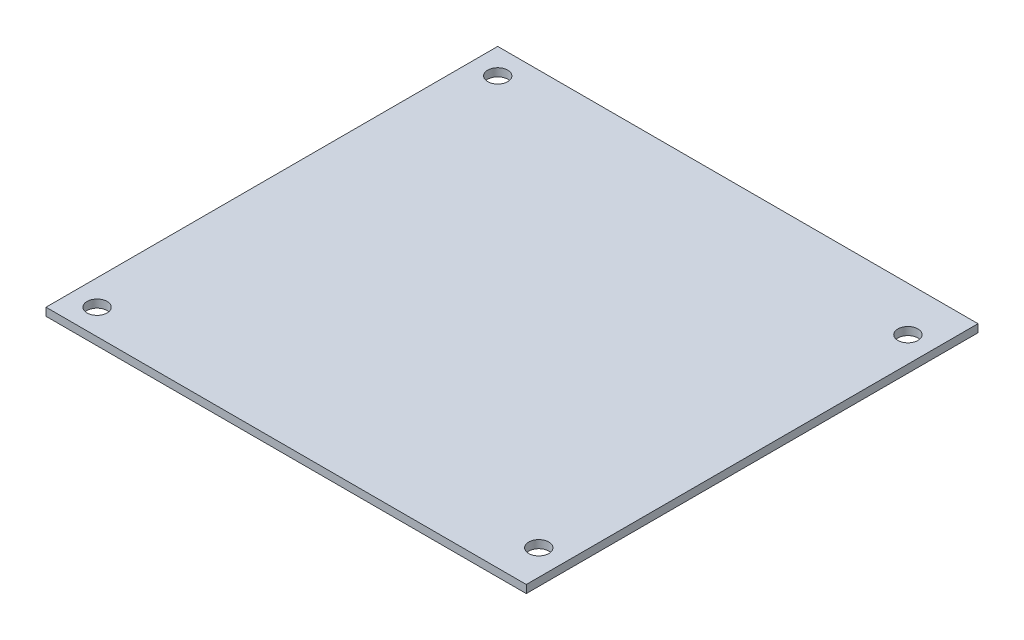
ISO-10303-21;
HEADER;
FILE_DESCRIPTION(('STEP AP214'),'2;1');
FILE_NAME('part.step','',(''),(''),'','','');
FILE_SCHEMA(('AUTOMOTIVE_DESIGN { 1 0 10303 214 1 1 1 1 }'));
ENDSEC;
DATA;
#1=APPLICATION_CONTEXT('core data for automotive mechanical design processes');
#2=APPLICATION_PROTOCOL_DEFINITION('international standard','automotive_design',2000,#1);
#3=PRODUCT_CONTEXT('',#1,'mechanical');
#4=PRODUCT('Part','Part','',(#3));
#5=PRODUCT_RELATED_PRODUCT_CATEGORY('part','',(#4));
#6=PRODUCT_DEFINITION_FORMATION('','',#4);
#7=PRODUCT_DEFINITION_CONTEXT('part definition',#1,'design');
#8=PRODUCT_DEFINITION('design','',#6,#7);
#9=PRODUCT_DEFINITION_SHAPE('','',#8);
#10=(LENGTH_UNIT() NAMED_UNIT(*) SI_UNIT(.MILLI.,.METRE.));
#11=(NAMED_UNIT(*) PLANE_ANGLE_UNIT() SI_UNIT($,.RADIAN.));
#12=(NAMED_UNIT(*) SI_UNIT($,.STERADIAN.) SOLID_ANGLE_UNIT());
#13=UNCERTAINTY_MEASURE_WITH_UNIT(LENGTH_MEASURE(1.E-05),#10,'distance_accuracy_value','');
#14=(GEOMETRIC_REPRESENTATION_CONTEXT(3) GLOBAL_UNCERTAINTY_ASSIGNED_CONTEXT((#13)) GLOBAL_UNIT_ASSIGNED_CONTEXT((#10,
#11,#12)) REPRESENTATION_CONTEXT('',''));
#15=CARTESIAN_POINT('',(0.,0.,0.));
#16=DIRECTION('',(0.,0.,1.));
#17=DIRECTION('',(1.,0.,0.));
#18=AXIS2_PLACEMENT_3D('',#15,#16,#17);
#19=CARTESIAN_POINT('',(0.,1.58,0.));
#20=DIRECTION('',(0.,-1.,0.));
#21=DIRECTION('',(0.,0.,-1.));
#22=AXIS2_PLACEMENT_3D('',#19,#20,#21);
#23=PLANE('',#22);
#24=DIRECTION('',(0.,0.,-1.));
#25=VECTOR('',#24,1.);
#26=CARTESIAN_POINT('',(47.95,1.58,45.1));
#27=LINE('',#26,#25);
#28=CARTESIAN_POINT('',(47.95,1.58,45.1));
#29=VERTEX_POINT('',#28);
#30=CARTESIAN_POINT('',(47.95,1.58,-45.1));
#31=VERTEX_POINT('',#30);
#32=EDGE_CURVE('E85',#29,#31,#27,.T.);
#33=ORIENTED_EDGE('',*,*,#32,.T.);
#34=DIRECTION('',(-1.,0.,0.));
#35=VECTOR('',#34,1.);
#36=CARTESIAN_POINT('',(-47.95,1.58,-45.1));
#37=LINE('',#36,#35);
#38=CARTESIAN_POINT('',(-47.95,1.58,-45.1));
#39=VERTEX_POINT('',#38);
#40=EDGE_CURVE('E80',#31,#39,#37,.T.);
#41=ORIENTED_EDGE('',*,*,#40,.T.);
#42=DIRECTION('',(0.,0.,1.));
#43=VECTOR('',#42,1.);
#44=CARTESIAN_POINT('',(-47.95,1.58,45.1));
#45=LINE('',#44,#43);
#46=CARTESIAN_POINT('',(-47.95,1.58,45.1));
#47=VERTEX_POINT('',#46);
#48=EDGE_CURVE('E83',#39,#47,#45,.T.);
#49=ORIENTED_EDGE('',*,*,#48,.T.);
#50=DIRECTION('',(1.,0.,0.));
#51=VECTOR('',#50,1.);
#52=CARTESIAN_POINT('',(-47.95,1.58,45.1));
#53=LINE('',#52,#51);
#54=EDGE_CURVE('E50',#47,#29,#53,.T.);
#55=ORIENTED_EDGE('',*,*,#54,.T.);
#56=EDGE_LOOP('',(#33,#41,#49,#55));
#57=FACE_BOUND('',#56,.T.);
#58=CARTESIAN_POINT('',(-42.85,1.58,-40.));
#59=DIRECTION('',(0.,1.,0.));
#60=DIRECTION('',(0.,0.,1.));
#61=AXIS2_PLACEMENT_3D('',#58,#59,#60);
#62=CIRCLE('',#61,2.);
#63=CARTESIAN_POINT('',(-42.85,1.58,-42.));
#64=VERTEX_POINT('',#63);
#65=EDGE_CURVE('E100',#64,#64,#62,.T.);
#66=ORIENTED_EDGE('',*,*,#65,.F.);
#67=EDGE_LOOP('',(#66));
#68=FACE_BOUND('',#67,.T.);
#69=CARTESIAN_POINT('',(42.85,1.58,-36.2));
#70=DIRECTION('',(0.,1.,0.));
#71=DIRECTION('',(0.,0.,1.));
#72=AXIS2_PLACEMENT_3D('',#69,#70,#71);
#73=CIRCLE('',#72,2.);
#74=CARTESIAN_POINT('',(42.85,1.58,-38.2));
#75=VERTEX_POINT('',#74);
#76=EDGE_CURVE('E115',#75,#75,#73,.T.);
#77=ORIENTED_EDGE('',*,*,#76,.F.);
#78=EDGE_LOOP('',(#77));
#79=FACE_BOUND('',#78,.T.);
#80=CARTESIAN_POINT('',(-42.85,1.58,40.));
#81=DIRECTION('',(0.,1.,0.));
#82=DIRECTION('',(0.,0.,1.));
#83=AXIS2_PLACEMENT_3D('',#80,#81,#82);
#84=CIRCLE('',#83,2.);
#85=CARTESIAN_POINT('',(-42.85,1.58,38.));
#86=VERTEX_POINT('',#85);
#87=EDGE_CURVE('E121',#86,#86,#84,.T.);
#88=ORIENTED_EDGE('',*,*,#87,.F.);
#89=EDGE_LOOP('',(#88));
#90=FACE_BOUND('',#89,.T.);
#91=CARTESIAN_POINT('',(42.85,1.58,37.5));
#92=DIRECTION('',(0.,1.,0.));
#93=DIRECTION('',(0.,0.,1.));
#94=AXIS2_PLACEMENT_3D('',#91,#92,#93);
#95=CIRCLE('',#94,2.);
#96=CARTESIAN_POINT('',(42.85,1.58,35.5));
#97=VERTEX_POINT('',#96);
#98=EDGE_CURVE('E127',#97,#97,#95,.T.);
#99=ORIENTED_EDGE('',*,*,#98,.F.);
#100=EDGE_LOOP('',(#99));
#101=FACE_BOUND('',#100,.T.);
#102=ADVANCED_FACE('F33',(#57,#68,#79,#90,#101),#23,.F.);
#103=CARTESIAN_POINT('',(0.,0.,0.));
#104=DIRECTION('',(0.,-1.,0.));
#105=DIRECTION('',(0.,0.,-1.));
#106=AXIS2_PLACEMENT_3D('',#103,#104,#105);
#107=PLANE('',#106);
#108=CARTESIAN_POINT('',(-42.85,0.,40.));
#109=DIRECTION('',(0.,1.,0.));
#110=DIRECTION('',(0.,0.,1.));
#111=AXIS2_PLACEMENT_3D('',#108,#109,#110);
#112=CIRCLE('',#111,2.);
#113=CARTESIAN_POINT('',(-42.85,0.,38.));
#114=VERTEX_POINT('',#113);
#115=EDGE_CURVE('E124',#114,#114,#112,.T.);
#116=ORIENTED_EDGE('',*,*,#115,.T.);
#117=EDGE_LOOP('',(#116));
#118=FACE_BOUND('',#117,.T.);
#119=CARTESIAN_POINT('',(-42.85,0.,-40.));
#120=DIRECTION('',(0.,1.,0.));
#121=DIRECTION('',(0.,0.,1.));
#122=AXIS2_PLACEMENT_3D('',#119,#120,#121);
#123=CIRCLE('',#122,2.);
#124=CARTESIAN_POINT('',(-42.85,0.,-42.));
#125=VERTEX_POINT('',#124);
#126=EDGE_CURVE('E112',#125,#125,#123,.T.);
#127=ORIENTED_EDGE('',*,*,#126,.T.);
#128=EDGE_LOOP('',(#127));
#129=FACE_BOUND('',#128,.T.);
#130=DIRECTION('',(0.,0.,-1.));
#131=VECTOR('',#130,1.);
#132=CARTESIAN_POINT('',(47.95,0.,45.1));
#133=LINE('',#132,#131);
#134=CARTESIAN_POINT('',(47.95,0.,45.1));
#135=VERTEX_POINT('',#134);
#136=CARTESIAN_POINT('',(47.95,0.,-45.1));
#137=VERTEX_POINT('',#136);
#138=EDGE_CURVE('E97',#135,#137,#133,.T.);
#139=ORIENTED_EDGE('',*,*,#138,.F.);
#140=DIRECTION('',(1.,0.,0.));
#141=VECTOR('',#140,1.);
#142=CARTESIAN_POINT('',(-47.95,0.,45.1));
#143=LINE('',#142,#141);
#144=CARTESIAN_POINT('',(-47.95,0.,45.1));
#145=VERTEX_POINT('',#144);
#146=EDGE_CURVE('E73',#145,#135,#143,.T.);
#147=ORIENTED_EDGE('',*,*,#146,.F.);
#148=DIRECTION('',(0.,0.,1.));
#149=VECTOR('',#148,1.);
#150=CARTESIAN_POINT('',(-47.95,0.,45.1));
#151=LINE('',#150,#149);
#152=CARTESIAN_POINT('',(-47.95,0.,-45.1));
#153=VERTEX_POINT('',#152);
#154=EDGE_CURVE('E67',#153,#145,#151,.T.);
#155=ORIENTED_EDGE('',*,*,#154,.F.);
#156=DIRECTION('',(-1.,0.,0.));
#157=VECTOR('',#156,1.);
#158=CARTESIAN_POINT('',(-47.95,0.,-45.1));
#159=LINE('',#158,#157);
#160=EDGE_CURVE('E89',#137,#153,#159,.T.);
#161=ORIENTED_EDGE('',*,*,#160,.F.);
#162=EDGE_LOOP('',(#139,#147,#155,#161));
#163=FACE_BOUND('',#162,.T.);
#164=CARTESIAN_POINT('',(42.85,0.,-36.2));
#165=DIRECTION('',(0.,1.,0.));
#166=DIRECTION('',(0.,0.,1.));
#167=AXIS2_PLACEMENT_3D('',#164,#165,#166);
#168=CIRCLE('',#167,2.);
#169=CARTESIAN_POINT('',(42.85,0.,-38.2));
#170=VERTEX_POINT('',#169);
#171=EDGE_CURVE('E118',#170,#170,#168,.T.);
#172=ORIENTED_EDGE('',*,*,#171,.T.);
#173=EDGE_LOOP('',(#172));
#174=FACE_BOUND('',#173,.T.);
#175=CARTESIAN_POINT('',(42.85,0.,37.5));
#176=DIRECTION('',(0.,1.,0.));
#177=DIRECTION('',(0.,0.,1.));
#178=AXIS2_PLACEMENT_3D('',#175,#176,#177);
#179=CIRCLE('',#178,2.);
#180=CARTESIAN_POINT('',(42.85,0.,35.5));
#181=VERTEX_POINT('',#180);
#182=EDGE_CURVE('E130',#181,#181,#179,.T.);
#183=ORIENTED_EDGE('',*,*,#182,.T.);
#184=EDGE_LOOP('',(#183));
#185=FACE_BOUND('',#184,.T.);
#186=ADVANCED_FACE('F108',(#118,#129,#163,#174,#185),#107,.T.);
#187=CARTESIAN_POINT('',(47.95,1.58,45.1));
#188=DIRECTION('',(-1.,0.,0.));
#189=DIRECTION('',(0.,0.,1.));
#190=AXIS2_PLACEMENT_3D('',#187,#188,#189);
#191=PLANE('',#190);
#192=ORIENTED_EDGE('',*,*,#138,.T.);
#193=DIRECTION('',(0.,-1.,0.));
#194=VECTOR('',#193,1.);
#195=CARTESIAN_POINT('',(47.95,1.58,-45.1));
#196=LINE('',#195,#194);
#197=EDGE_CURVE('E11',#31,#137,#196,.T.);
#198=ORIENTED_EDGE('',*,*,#197,.F.);
#199=ORIENTED_EDGE('',*,*,#32,.F.);
#200=DIRECTION('',(0.,-1.,0.));
#201=VECTOR('',#200,1.);
#202=CARTESIAN_POINT('',(47.95,1.58,45.1));
#203=LINE('',#202,#201);
#204=EDGE_CURVE('E93',#29,#135,#203,.T.);
#205=ORIENTED_EDGE('',*,*,#204,.T.);
#206=EDGE_LOOP('',(#192,#198,#199,#205));
#207=FACE_BOUND('',#206,.T.);
#208=ADVANCED_FACE('F35',(#207),#191,.F.);
#209=CARTESIAN_POINT('',(-47.95,1.58,-45.1));
#210=DIRECTION('',(0.,0.,1.));
#211=DIRECTION('',(1.,0.,0.));
#212=AXIS2_PLACEMENT_3D('',#209,#210,#211);
#213=PLANE('',#212);
#214=ORIENTED_EDGE('',*,*,#160,.T.);
#215=DIRECTION('',(0.,-1.,0.));
#216=VECTOR('',#215,1.);
#217=CARTESIAN_POINT('',(-47.95,1.58,-45.1));
#218=LINE('',#217,#216);
#219=EDGE_CURVE('E42',#39,#153,#218,.T.);
#220=ORIENTED_EDGE('',*,*,#219,.F.);
#221=ORIENTED_EDGE('',*,*,#40,.F.);
#222=ORIENTED_EDGE('',*,*,#197,.T.);
#223=EDGE_LOOP('',(#214,#220,#221,#222));
#224=FACE_BOUND('',#223,.T.);
#225=ADVANCED_FACE('F88',(#224),#213,.F.);
#226=CARTESIAN_POINT('',(-47.95,1.58,45.1));
#227=DIRECTION('',(1.,0.,0.));
#228=DIRECTION('',(0.,0.,-1.));
#229=AXIS2_PLACEMENT_3D('',#226,#227,#228);
#230=PLANE('',#229);
#231=ORIENTED_EDGE('',*,*,#154,.T.);
#232=DIRECTION('',(0.,-1.,0.));
#233=VECTOR('',#232,1.);
#234=CARTESIAN_POINT('',(-47.95,1.58,45.1));
#235=LINE('',#234,#233);
#236=EDGE_CURVE('E90',#47,#145,#235,.T.);
#237=ORIENTED_EDGE('',*,*,#236,.F.);
#238=ORIENTED_EDGE('',*,*,#48,.F.);
#239=ORIENTED_EDGE('',*,*,#219,.T.);
#240=EDGE_LOOP('',(#231,#237,#238,#239));
#241=FACE_BOUND('',#240,.T.);
#242=ADVANCED_FACE('F91',(#241),#230,.F.);
#243=CARTESIAN_POINT('',(-47.95,1.58,45.1));
#244=DIRECTION('',(0.,0.,-1.));
#245=DIRECTION('',(-1.,0.,0.));
#246=AXIS2_PLACEMENT_3D('',#243,#244,#245);
#247=PLANE('',#246);
#248=ORIENTED_EDGE('',*,*,#146,.T.);
#249=ORIENTED_EDGE('',*,*,#204,.F.);
#250=ORIENTED_EDGE('',*,*,#54,.F.);
#251=ORIENTED_EDGE('',*,*,#236,.T.);
#252=EDGE_LOOP('',(#248,#249,#250,#251));
#253=FACE_BOUND('',#252,.T.);
#254=ADVANCED_FACE('F105',(#253),#247,.F.);
#255=CARTESIAN_POINT('',(-42.85,1.58,-40.));
#256=DIRECTION('',(0.,-1.,0.));
#257=DIRECTION('',(0.,0.,-1.));
#258=AXIS2_PLACEMENT_3D('',#255,#256,#257);
#259=CYLINDRICAL_SURFACE('',#258,2.);
#260=CARTESIAN_POINT('',(-42.85,1.58,-42.));
#261=CARTESIAN_POINT('',(-42.85,1.56354166666667,-42.));
#262=CARTESIAN_POINT('',(-42.85,1.54708333333333,-42.));
#263=CARTESIAN_POINT('',(-42.85,1.51416666666667,-42.));
#264=CARTESIAN_POINT('',(-42.85,1.49770833333333,-42.));
#265=CARTESIAN_POINT('',(-42.85,1.46479166666667,-42.));
#266=CARTESIAN_POINT('',(-42.85,1.44833333333333,-42.));
#267=CARTESIAN_POINT('',(-42.85,1.41541666666667,-42.));
#268=CARTESIAN_POINT('',(-42.85,1.39895833333333,-42.));
#269=CARTESIAN_POINT('',(-42.85,1.36604166666667,-42.));
#270=CARTESIAN_POINT('',(-42.85,1.34958333333333,-42.));
#271=CARTESIAN_POINT('',(-42.85,1.31666666666667,-42.));
#272=CARTESIAN_POINT('',(-42.85,1.30020833333333,-42.));
#273=CARTESIAN_POINT('',(-42.85,1.26729166666667,-42.));
#274=CARTESIAN_POINT('',(-42.85,1.25083333333333,-42.));
#275=CARTESIAN_POINT('',(-42.85,1.21791666666667,-42.));
#276=CARTESIAN_POINT('',(-42.85,1.20145833333333,-42.));
#277=CARTESIAN_POINT('',(-42.85,1.16854166666667,-42.));
#278=CARTESIAN_POINT('',(-42.85,1.15208333333333,-42.));
#279=CARTESIAN_POINT('',(-42.85,1.11916666666667,-42.));
#280=CARTESIAN_POINT('',(-42.85,1.10270833333333,-42.));
#281=CARTESIAN_POINT('',(-42.85,1.06979166666667,-42.));
#282=CARTESIAN_POINT('',(-42.85,1.05333333333333,-42.));
#283=CARTESIAN_POINT('',(-42.85,1.02041666666667,-42.));
#284=CARTESIAN_POINT('',(-42.85,1.00395833333333,-42.));
#285=CARTESIAN_POINT('',(-42.85,0.971041666666667,-42.));
#286=CARTESIAN_POINT('',(-42.85,0.954583333333333,-42.));
#287=CARTESIAN_POINT('',(-42.85,0.921666666666667,-42.));
#288=CARTESIAN_POINT('',(-42.85,0.905208333333333,-42.));
#289=CARTESIAN_POINT('',(-42.85,0.872291666666667,-42.));
#290=CARTESIAN_POINT('',(-42.85,0.855833333333333,-42.));
#291=CARTESIAN_POINT('',(-42.85,0.822916666666667,-42.));
#292=CARTESIAN_POINT('',(-42.85,0.806458333333333,-42.));
#293=CARTESIAN_POINT('',(-42.85,0.773541666666667,-42.));
#294=CARTESIAN_POINT('',(-42.85,0.757083333333333,-42.));
#295=CARTESIAN_POINT('',(-42.85,0.724166666666667,-42.));
#296=CARTESIAN_POINT('',(-42.85,0.707708333333333,-42.));
#297=CARTESIAN_POINT('',(-42.85,0.674791666666667,-42.));
#298=CARTESIAN_POINT('',(-42.85,0.658333333333333,-42.));
#299=CARTESIAN_POINT('',(-42.85,0.625416666666667,-42.));
#300=CARTESIAN_POINT('',(-42.85,0.608958333333333,-42.));
#301=CARTESIAN_POINT('',(-42.85,0.576041666666667,-42.));
#302=CARTESIAN_POINT('',(-42.85,0.559583333333333,-42.));
#303=CARTESIAN_POINT('',(-42.85,0.526666666666667,-42.));
#304=CARTESIAN_POINT('',(-42.85,0.510208333333333,-42.));
#305=CARTESIAN_POINT('',(-42.85,0.477291666666667,-42.));
#306=CARTESIAN_POINT('',(-42.85,0.460833333333333,-42.));
#307=CARTESIAN_POINT('',(-42.85,0.427916666666667,-42.));
#308=CARTESIAN_POINT('',(-42.85,0.411458333333333,-42.));
#309=CARTESIAN_POINT('',(-42.85,0.378541666666667,-42.));
#310=CARTESIAN_POINT('',(-42.85,0.362083333333333,-42.));
#311=CARTESIAN_POINT('',(-42.85,0.329166666666667,-42.));
#312=CARTESIAN_POINT('',(-42.85,0.312708333333333,-42.));
#313=CARTESIAN_POINT('',(-42.85,0.279791666666667,-42.));
#314=CARTESIAN_POINT('',(-42.85,0.263333333333333,-42.));
#315=CARTESIAN_POINT('',(-42.85,0.230416666666667,-42.));
#316=CARTESIAN_POINT('',(-42.85,0.213958333333333,-42.));
#317=CARTESIAN_POINT('',(-42.85,0.181041666666667,-42.));
#318=CARTESIAN_POINT('',(-42.85,0.164583333333333,-42.));
#319=CARTESIAN_POINT('',(-42.85,0.131666666666667,-42.));
#320=CARTESIAN_POINT('',(-42.85,0.115208333333333,-42.));
#321=CARTESIAN_POINT('',(-42.85,0.0822916666666667,-42.));
#322=CARTESIAN_POINT('',(-42.85,0.0658333333333333,-42.));
#323=CARTESIAN_POINT('',(-42.85,0.0329166666666666,-42.));
#324=CARTESIAN_POINT('',(-42.85,0.0164583333333333,-42.));
#325=CARTESIAN_POINT('',(-42.85,0.,-42.));
#326=B_SPLINE_CURVE_WITH_KNOTS('',3,(#260,#261,#262,#263,#264,#265,#266,#267,#268,#269,#270,
#271,#272,#273,#274,#275,#276,#277,#278,#279,#280,#281,#282,#283,#284,#285,#286,#287,#288,#289,
#290,#291,#292,#293,#294,#295,#296,#297,#298,#299,#300,#301,#302,#303,#304,#305,#306,#307,#308,
#309,#310,#311,#312,#313,#314,#315,#316,#317,#318,#319,#320,#321,#322,#323,#324,#325),
.UNSPECIFIED.,.F.,.F.,(4,2,2,2,2,2,2,2,2,2,2,2,2,2,2,2,2,2,2,2,2,2,2,2,2,2,2,2,2,2,2,2,4),(0.,
0.0493749999999999,0.0987499999999999,0.148125,0.1975,0.246875,0.29625,0.345625,0.395,0.444375,
0.49375,0.543125,0.5925,0.641875,0.69125,0.740625,0.79,0.839375,0.88875,0.938125,0.9875,
1.036875,1.08625,1.135625,1.185,1.234375,1.28375,1.333125,1.3825,1.431875,1.48125,1.530625,
1.58),.UNSPECIFIED.);
#327=EDGE_CURVE('BSEAM147',#64,#125,#326,.T.);
#328=ORIENTED_EDGE('',*,*,#65,.T.);
#329=ORIENTED_EDGE('',*,*,#126,.F.);
#330=ORIENTED_EDGE('',*,*,#327,.T.);
#331=ORIENTED_EDGE('',*,*,#327,.F.);
#332=EDGE_LOOP('',(#328,#330,#329,#331));
#333=FACE_BOUND('',#332,.T.);
#334=ADVANCED_FACE('F147',(#333),#259,.F.);
#335=CARTESIAN_POINT('',(42.85,1.58,-36.2));
#336=DIRECTION('',(0.,-1.,0.));
#337=DIRECTION('',(0.,0.,-1.));
#338=AXIS2_PLACEMENT_3D('',#335,#336,#337);
#339=CYLINDRICAL_SURFACE('',#338,2.);
#340=CARTESIAN_POINT('',(42.85,1.58,-38.2));
#341=CARTESIAN_POINT('',(42.85,1.56354166666667,-38.2));
#342=CARTESIAN_POINT('',(42.85,1.54708333333333,-38.2));
#343=CARTESIAN_POINT('',(42.85,1.51416666666667,-38.2));
#344=CARTESIAN_POINT('',(42.85,1.49770833333333,-38.2));
#345=CARTESIAN_POINT('',(42.85,1.46479166666667,-38.2));
#346=CARTESIAN_POINT('',(42.85,1.44833333333333,-38.2));
#347=CARTESIAN_POINT('',(42.85,1.41541666666667,-38.2));
#348=CARTESIAN_POINT('',(42.85,1.39895833333333,-38.2));
#349=CARTESIAN_POINT('',(42.85,1.36604166666667,-38.2));
#350=CARTESIAN_POINT('',(42.85,1.34958333333333,-38.2));
#351=CARTESIAN_POINT('',(42.85,1.31666666666667,-38.2));
#352=CARTESIAN_POINT('',(42.85,1.30020833333333,-38.2));
#353=CARTESIAN_POINT('',(42.85,1.26729166666667,-38.2));
#354=CARTESIAN_POINT('',(42.85,1.25083333333333,-38.2));
#355=CARTESIAN_POINT('',(42.85,1.21791666666667,-38.2));
#356=CARTESIAN_POINT('',(42.85,1.20145833333333,-38.2));
#357=CARTESIAN_POINT('',(42.85,1.16854166666667,-38.2));
#358=CARTESIAN_POINT('',(42.85,1.15208333333333,-38.2));
#359=CARTESIAN_POINT('',(42.85,1.11916666666667,-38.2));
#360=CARTESIAN_POINT('',(42.85,1.10270833333333,-38.2));
#361=CARTESIAN_POINT('',(42.85,1.06979166666667,-38.2));
#362=CARTESIAN_POINT('',(42.85,1.05333333333333,-38.2));
#363=CARTESIAN_POINT('',(42.85,1.02041666666667,-38.2));
#364=CARTESIAN_POINT('',(42.85,1.00395833333333,-38.2));
#365=CARTESIAN_POINT('',(42.85,0.971041666666667,-38.2));
#366=CARTESIAN_POINT('',(42.85,0.954583333333333,-38.2));
#367=CARTESIAN_POINT('',(42.85,0.921666666666667,-38.2));
#368=CARTESIAN_POINT('',(42.85,0.905208333333333,-38.2));
#369=CARTESIAN_POINT('',(42.85,0.872291666666667,-38.2));
#370=CARTESIAN_POINT('',(42.85,0.855833333333333,-38.2));
#371=CARTESIAN_POINT('',(42.85,0.822916666666667,-38.2));
#372=CARTESIAN_POINT('',(42.85,0.806458333333333,-38.2));
#373=CARTESIAN_POINT('',(42.85,0.773541666666667,-38.2));
#374=CARTESIAN_POINT('',(42.85,0.757083333333333,-38.2));
#375=CARTESIAN_POINT('',(42.85,0.724166666666667,-38.2));
#376=CARTESIAN_POINT('',(42.85,0.707708333333333,-38.2));
#377=CARTESIAN_POINT('',(42.85,0.674791666666667,-38.2));
#378=CARTESIAN_POINT('',(42.85,0.658333333333333,-38.2));
#379=CARTESIAN_POINT('',(42.85,0.625416666666667,-38.2));
#380=CARTESIAN_POINT('',(42.85,0.608958333333333,-38.2));
#381=CARTESIAN_POINT('',(42.85,0.576041666666667,-38.2));
#382=CARTESIAN_POINT('',(42.85,0.559583333333333,-38.2));
#383=CARTESIAN_POINT('',(42.85,0.526666666666667,-38.2));
#384=CARTESIAN_POINT('',(42.85,0.510208333333333,-38.2));
#385=CARTESIAN_POINT('',(42.85,0.477291666666667,-38.2));
#386=CARTESIAN_POINT('',(42.85,0.460833333333333,-38.2));
#387=CARTESIAN_POINT('',(42.85,0.427916666666667,-38.2));
#388=CARTESIAN_POINT('',(42.85,0.411458333333333,-38.2));
#389=CARTESIAN_POINT('',(42.85,0.378541666666667,-38.2));
#390=CARTESIAN_POINT('',(42.85,0.362083333333333,-38.2));
#391=CARTESIAN_POINT('',(42.85,0.329166666666667,-38.2));
#392=CARTESIAN_POINT('',(42.85,0.312708333333333,-38.2));
#393=CARTESIAN_POINT('',(42.85,0.279791666666667,-38.2));
#394=CARTESIAN_POINT('',(42.85,0.263333333333333,-38.2));
#395=CARTESIAN_POINT('',(42.85,0.230416666666667,-38.2));
#396=CARTESIAN_POINT('',(42.85,0.213958333333333,-38.2));
#397=CARTESIAN_POINT('',(42.85,0.181041666666667,-38.2));
#398=CARTESIAN_POINT('',(42.85,0.164583333333333,-38.2));
#399=CARTESIAN_POINT('',(42.85,0.131666666666667,-38.2));
#400=CARTESIAN_POINT('',(42.85,0.115208333333333,-38.2));
#401=CARTESIAN_POINT('',(42.85,0.0822916666666667,-38.2));
#402=CARTESIAN_POINT('',(42.85,0.0658333333333333,-38.2));
#403=CARTESIAN_POINT('',(42.85,0.0329166666666666,-38.2));
#404=CARTESIAN_POINT('',(42.85,0.0164583333333333,-38.2));
#405=CARTESIAN_POINT('',(42.85,0.,-38.2));
#406=B_SPLINE_CURVE_WITH_KNOTS('',3,(#340,#341,#342,#343,#344,#345,#346,#347,#348,#349,#350,
#351,#352,#353,#354,#355,#356,#357,#358,#359,#360,#361,#362,#363,#364,#365,#366,#367,#368,#369,
#370,#371,#372,#373,#374,#375,#376,#377,#378,#379,#380,#381,#382,#383,#384,#385,#386,#387,#388,
#389,#390,#391,#392,#393,#394,#395,#396,#397,#398,#399,#400,#401,#402,#403,#404,#405),
.UNSPECIFIED.,.F.,.F.,(4,2,2,2,2,2,2,2,2,2,2,2,2,2,2,2,2,2,2,2,2,2,2,2,2,2,2,2,2,2,2,2,4),(0.,
0.0493749999999999,0.0987499999999999,0.148125,0.1975,0.246875,0.29625,0.345625,0.395,0.444375,
0.49375,0.543125,0.5925,0.641875,0.69125,0.740625,0.79,0.839375,0.88875,0.938125,0.9875,
1.036875,1.08625,1.135625,1.185,1.234375,1.28375,1.333125,1.3825,1.431875,1.48125,1.530625,
1.58),.UNSPECIFIED.);
#407=EDGE_CURVE('BSEAM193',#75,#170,#406,.T.);
#408=ORIENTED_EDGE('',*,*,#76,.T.);
#409=ORIENTED_EDGE('',*,*,#171,.F.);
#410=ORIENTED_EDGE('',*,*,#407,.T.);
#411=ORIENTED_EDGE('',*,*,#407,.F.);
#412=EDGE_LOOP('',(#408,#410,#409,#411));
#413=FACE_BOUND('',#412,.T.);
#414=ADVANCED_FACE('F193',(#413),#339,.F.);
#415=CARTESIAN_POINT('',(-42.85,1.58,40.));
#416=DIRECTION('',(0.,-1.,0.));
#417=DIRECTION('',(0.,0.,-1.));
#418=AXIS2_PLACEMENT_3D('',#415,#416,#417);
#419=CYLINDRICAL_SURFACE('',#418,2.);
#420=CARTESIAN_POINT('',(-42.85,1.58,38.));
#421=CARTESIAN_POINT('',(-42.85,1.56354166666667,38.));
#422=CARTESIAN_POINT('',(-42.85,1.54708333333333,38.));
#423=CARTESIAN_POINT('',(-42.85,1.51416666666667,38.));
#424=CARTESIAN_POINT('',(-42.85,1.49770833333333,38.));
#425=CARTESIAN_POINT('',(-42.85,1.46479166666667,38.));
#426=CARTESIAN_POINT('',(-42.85,1.44833333333333,38.));
#427=CARTESIAN_POINT('',(-42.85,1.41541666666667,38.));
#428=CARTESIAN_POINT('',(-42.85,1.39895833333333,38.));
#429=CARTESIAN_POINT('',(-42.85,1.36604166666667,38.));
#430=CARTESIAN_POINT('',(-42.85,1.34958333333333,38.));
#431=CARTESIAN_POINT('',(-42.85,1.31666666666667,38.));
#432=CARTESIAN_POINT('',(-42.85,1.30020833333333,38.));
#433=CARTESIAN_POINT('',(-42.85,1.26729166666667,38.));
#434=CARTESIAN_POINT('',(-42.85,1.25083333333333,38.));
#435=CARTESIAN_POINT('',(-42.85,1.21791666666667,38.));
#436=CARTESIAN_POINT('',(-42.85,1.20145833333333,38.));
#437=CARTESIAN_POINT('',(-42.85,1.16854166666667,38.));
#438=CARTESIAN_POINT('',(-42.85,1.15208333333333,38.));
#439=CARTESIAN_POINT('',(-42.85,1.11916666666667,38.));
#440=CARTESIAN_POINT('',(-42.85,1.10270833333333,38.));
#441=CARTESIAN_POINT('',(-42.85,1.06979166666667,38.));
#442=CARTESIAN_POINT('',(-42.85,1.05333333333333,38.));
#443=CARTESIAN_POINT('',(-42.85,1.02041666666667,38.));
#444=CARTESIAN_POINT('',(-42.85,1.00395833333333,38.));
#445=CARTESIAN_POINT('',(-42.85,0.971041666666667,38.));
#446=CARTESIAN_POINT('',(-42.85,0.954583333333333,38.));
#447=CARTESIAN_POINT('',(-42.85,0.921666666666667,38.));
#448=CARTESIAN_POINT('',(-42.85,0.905208333333333,38.));
#449=CARTESIAN_POINT('',(-42.85,0.872291666666667,38.));
#450=CARTESIAN_POINT('',(-42.85,0.855833333333333,38.));
#451=CARTESIAN_POINT('',(-42.85,0.822916666666667,38.));
#452=CARTESIAN_POINT('',(-42.85,0.806458333333333,38.));
#453=CARTESIAN_POINT('',(-42.85,0.773541666666667,38.));
#454=CARTESIAN_POINT('',(-42.85,0.757083333333333,38.));
#455=CARTESIAN_POINT('',(-42.85,0.724166666666667,38.));
#456=CARTESIAN_POINT('',(-42.85,0.707708333333333,38.));
#457=CARTESIAN_POINT('',(-42.85,0.674791666666667,38.));
#458=CARTESIAN_POINT('',(-42.85,0.658333333333333,38.));
#459=CARTESIAN_POINT('',(-42.85,0.625416666666667,38.));
#460=CARTESIAN_POINT('',(-42.85,0.608958333333333,38.));
#461=CARTESIAN_POINT('',(-42.85,0.576041666666667,38.));
#462=CARTESIAN_POINT('',(-42.85,0.559583333333333,38.));
#463=CARTESIAN_POINT('',(-42.85,0.526666666666667,38.));
#464=CARTESIAN_POINT('',(-42.85,0.510208333333333,38.));
#465=CARTESIAN_POINT('',(-42.85,0.477291666666667,38.));
#466=CARTESIAN_POINT('',(-42.85,0.460833333333333,38.));
#467=CARTESIAN_POINT('',(-42.85,0.427916666666667,38.));
#468=CARTESIAN_POINT('',(-42.85,0.411458333333333,38.));
#469=CARTESIAN_POINT('',(-42.85,0.378541666666667,38.));
#470=CARTESIAN_POINT('',(-42.85,0.362083333333333,38.));
#471=CARTESIAN_POINT('',(-42.85,0.329166666666667,38.));
#472=CARTESIAN_POINT('',(-42.85,0.312708333333333,38.));
#473=CARTESIAN_POINT('',(-42.85,0.279791666666667,38.));
#474=CARTESIAN_POINT('',(-42.85,0.263333333333333,38.));
#475=CARTESIAN_POINT('',(-42.85,0.230416666666667,38.));
#476=CARTESIAN_POINT('',(-42.85,0.213958333333333,38.));
#477=CARTESIAN_POINT('',(-42.85,0.181041666666667,38.));
#478=CARTESIAN_POINT('',(-42.85,0.164583333333333,38.));
#479=CARTESIAN_POINT('',(-42.85,0.131666666666667,38.));
#480=CARTESIAN_POINT('',(-42.85,0.115208333333333,38.));
#481=CARTESIAN_POINT('',(-42.85,0.0822916666666667,38.));
#482=CARTESIAN_POINT('',(-42.85,0.0658333333333333,38.));
#483=CARTESIAN_POINT('',(-42.85,0.0329166666666666,38.));
#484=CARTESIAN_POINT('',(-42.85,0.0164583333333333,38.));
#485=CARTESIAN_POINT('',(-42.85,0.,38.));
#486=B_SPLINE_CURVE_WITH_KNOTS('',3,(#420,#421,#422,#423,#424,#425,#426,#427,#428,#429,#430,
#431,#432,#433,#434,#435,#436,#437,#438,#439,#440,#441,#442,#443,#444,#445,#446,#447,#448,#449,
#450,#451,#452,#453,#454,#455,#456,#457,#458,#459,#460,#461,#462,#463,#464,#465,#466,#467,#468,
#469,#470,#471,#472,#473,#474,#475,#476,#477,#478,#479,#480,#481,#482,#483,#484,#485),
.UNSPECIFIED.,.F.,.F.,(4,2,2,2,2,2,2,2,2,2,2,2,2,2,2,2,2,2,2,2,2,2,2,2,2,2,2,2,2,2,2,2,4),(0.,
0.0493749999999999,0.0987499999999999,0.148125,0.1975,0.246875,0.29625,0.345625,0.395,0.444375,
0.49375,0.543125,0.5925,0.641875,0.69125,0.740625,0.79,0.839375,0.88875,0.938125,0.9875,
1.036875,1.08625,1.135625,1.185,1.234375,1.28375,1.333125,1.3825,1.431875,1.48125,1.530625,
1.58),.UNSPECIFIED.);
#487=EDGE_CURVE('BSEAM201',#86,#114,#486,.T.);
#488=ORIENTED_EDGE('',*,*,#87,.T.);
#489=ORIENTED_EDGE('',*,*,#115,.F.);
#490=ORIENTED_EDGE('',*,*,#487,.T.);
#491=ORIENTED_EDGE('',*,*,#487,.F.);
#492=EDGE_LOOP('',(#488,#490,#489,#491));
#493=FACE_BOUND('',#492,.T.);
#494=ADVANCED_FACE('F201',(#493),#419,.F.);
#495=CARTESIAN_POINT('',(42.85,1.58,37.5));
#496=DIRECTION('',(0.,-1.,0.));
#497=DIRECTION('',(0.,0.,-1.));
#498=AXIS2_PLACEMENT_3D('',#495,#496,#497);
#499=CYLINDRICAL_SURFACE('',#498,2.);
#500=CARTESIAN_POINT('',(42.85,1.58,35.5));
#501=CARTESIAN_POINT('',(42.85,1.56354166666667,35.5));
#502=CARTESIAN_POINT('',(42.85,1.54708333333333,35.5));
#503=CARTESIAN_POINT('',(42.85,1.51416666666667,35.5));
#504=CARTESIAN_POINT('',(42.85,1.49770833333333,35.5));
#505=CARTESIAN_POINT('',(42.85,1.46479166666667,35.5));
#506=CARTESIAN_POINT('',(42.85,1.44833333333333,35.5));
#507=CARTESIAN_POINT('',(42.85,1.41541666666667,35.5));
#508=CARTESIAN_POINT('',(42.85,1.39895833333333,35.5));
#509=CARTESIAN_POINT('',(42.85,1.36604166666667,35.5));
#510=CARTESIAN_POINT('',(42.85,1.34958333333333,35.5));
#511=CARTESIAN_POINT('',(42.85,1.31666666666667,35.5));
#512=CARTESIAN_POINT('',(42.85,1.30020833333333,35.5));
#513=CARTESIAN_POINT('',(42.85,1.26729166666667,35.5));
#514=CARTESIAN_POINT('',(42.85,1.25083333333333,35.5));
#515=CARTESIAN_POINT('',(42.85,1.21791666666667,35.5));
#516=CARTESIAN_POINT('',(42.85,1.20145833333333,35.5));
#517=CARTESIAN_POINT('',(42.85,1.16854166666667,35.5));
#518=CARTESIAN_POINT('',(42.85,1.15208333333333,35.5));
#519=CARTESIAN_POINT('',(42.85,1.11916666666667,35.5));
#520=CARTESIAN_POINT('',(42.85,1.10270833333333,35.5));
#521=CARTESIAN_POINT('',(42.85,1.06979166666667,35.5));
#522=CARTESIAN_POINT('',(42.85,1.05333333333333,35.5));
#523=CARTESIAN_POINT('',(42.85,1.02041666666667,35.5));
#524=CARTESIAN_POINT('',(42.85,1.00395833333333,35.5));
#525=CARTESIAN_POINT('',(42.85,0.971041666666667,35.5));
#526=CARTESIAN_POINT('',(42.85,0.954583333333333,35.5));
#527=CARTESIAN_POINT('',(42.85,0.921666666666667,35.5));
#528=CARTESIAN_POINT('',(42.85,0.905208333333333,35.5));
#529=CARTESIAN_POINT('',(42.85,0.872291666666667,35.5));
#530=CARTESIAN_POINT('',(42.85,0.855833333333333,35.5));
#531=CARTESIAN_POINT('',(42.85,0.822916666666667,35.5));
#532=CARTESIAN_POINT('',(42.85,0.806458333333333,35.5));
#533=CARTESIAN_POINT('',(42.85,0.773541666666667,35.5));
#534=CARTESIAN_POINT('',(42.85,0.757083333333333,35.5));
#535=CARTESIAN_POINT('',(42.85,0.724166666666667,35.5));
#536=CARTESIAN_POINT('',(42.85,0.707708333333333,35.5));
#537=CARTESIAN_POINT('',(42.85,0.674791666666667,35.5));
#538=CARTESIAN_POINT('',(42.85,0.658333333333333,35.5));
#539=CARTESIAN_POINT('',(42.85,0.625416666666667,35.5));
#540=CARTESIAN_POINT('',(42.85,0.608958333333333,35.5));
#541=CARTESIAN_POINT('',(42.85,0.576041666666667,35.5));
#542=CARTESIAN_POINT('',(42.85,0.559583333333333,35.5));
#543=CARTESIAN_POINT('',(42.85,0.526666666666667,35.5));
#544=CARTESIAN_POINT('',(42.85,0.510208333333333,35.5));
#545=CARTESIAN_POINT('',(42.85,0.477291666666667,35.5));
#546=CARTESIAN_POINT('',(42.85,0.460833333333333,35.5));
#547=CARTESIAN_POINT('',(42.85,0.427916666666667,35.5));
#548=CARTESIAN_POINT('',(42.85,0.411458333333333,35.5));
#549=CARTESIAN_POINT('',(42.85,0.378541666666667,35.5));
#550=CARTESIAN_POINT('',(42.85,0.362083333333333,35.5));
#551=CARTESIAN_POINT('',(42.85,0.329166666666667,35.5));
#552=CARTESIAN_POINT('',(42.85,0.312708333333333,35.5));
#553=CARTESIAN_POINT('',(42.85,0.279791666666667,35.5));
#554=CARTESIAN_POINT('',(42.85,0.263333333333333,35.5));
#555=CARTESIAN_POINT('',(42.85,0.230416666666667,35.5));
#556=CARTESIAN_POINT('',(42.85,0.213958333333333,35.5));
#557=CARTESIAN_POINT('',(42.85,0.181041666666667,35.5));
#558=CARTESIAN_POINT('',(42.85,0.164583333333333,35.5));
#559=CARTESIAN_POINT('',(42.85,0.131666666666667,35.5));
#560=CARTESIAN_POINT('',(42.85,0.115208333333333,35.5));
#561=CARTESIAN_POINT('',(42.85,0.0822916666666667,35.5));
#562=CARTESIAN_POINT('',(42.85,0.0658333333333333,35.5));
#563=CARTESIAN_POINT('',(42.85,0.0329166666666666,35.5));
#564=CARTESIAN_POINT('',(42.85,0.0164583333333333,35.5));
#565=CARTESIAN_POINT('',(42.85,0.,35.5));
#566=B_SPLINE_CURVE_WITH_KNOTS('',3,(#500,#501,#502,#503,#504,#505,#506,#507,#508,#509,#510,
#511,#512,#513,#514,#515,#516,#517,#518,#519,#520,#521,#522,#523,#524,#525,#526,#527,#528,#529,
#530,#531,#532,#533,#534,#535,#536,#537,#538,#539,#540,#541,#542,#543,#544,#545,#546,#547,#548,
#549,#550,#551,#552,#553,#554,#555,#556,#557,#558,#559,#560,#561,#562,#563,#564,#565),
.UNSPECIFIED.,.F.,.F.,(4,2,2,2,2,2,2,2,2,2,2,2,2,2,2,2,2,2,2,2,2,2,2,2,2,2,2,2,2,2,2,2,4),(0.,
0.0493749999999999,0.0987499999999999,0.148125,0.1975,0.246875,0.29625,0.345625,0.395,0.444375,
0.49375,0.543125,0.5925,0.641875,0.69125,0.740625,0.79,0.839375,0.88875,0.938125,0.9875,
1.036875,1.08625,1.135625,1.185,1.234375,1.28375,1.333125,1.3825,1.431875,1.48125,1.530625,
1.58),.UNSPECIFIED.);
#567=EDGE_CURVE('BSEAM136',#97,#181,#566,.T.);
#568=ORIENTED_EDGE('',*,*,#98,.T.);
#569=ORIENTED_EDGE('',*,*,#182,.F.);
#570=ORIENTED_EDGE('',*,*,#567,.T.);
#571=ORIENTED_EDGE('',*,*,#567,.F.);
#572=EDGE_LOOP('',(#568,#570,#569,#571));
#573=FACE_BOUND('',#572,.T.);
#574=ADVANCED_FACE('F136',(#573),#499,.F.);
#575=CLOSED_SHELL('',(#102,#186,#208,#225,#242,#254,#334,#414,#494,#574));
#576=MANIFOLD_SOLID_BREP('B2',#575);
#577=ADVANCED_BREP_SHAPE_REPRESENTATION('',(#18,#576),#14);
#578=SHAPE_DEFINITION_REPRESENTATION(#9,#577);
ENDSEC;
END-ISO-10303-21;
